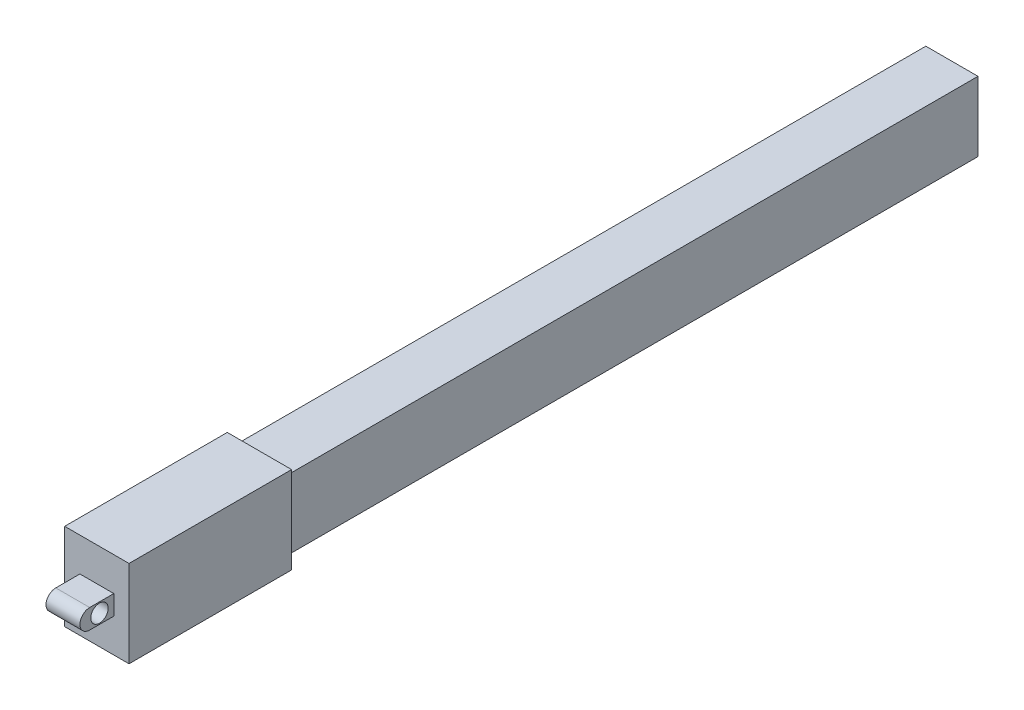
ISO-10303-21;
HEADER;
FILE_DESCRIPTION(('STEP AP214'),'2;1');
FILE_NAME('part.step','',(''),(''),'','','');
FILE_SCHEMA(('AUTOMOTIVE_DESIGN { 1 0 10303 214 1 1 1 1 }'));
ENDSEC;
DATA;
#1=APPLICATION_CONTEXT('core data for automotive mechanical design processes');
#2=APPLICATION_PROTOCOL_DEFINITION('international standard','automotive_design',2000,#1);
#3=PRODUCT_CONTEXT('',#1,'mechanical');
#4=PRODUCT('Part','Part','',(#3));
#5=PRODUCT_RELATED_PRODUCT_CATEGORY('part','',(#4));
#6=PRODUCT_DEFINITION_FORMATION('','',#4);
#7=PRODUCT_DEFINITION_CONTEXT('part definition',#1,'design');
#8=PRODUCT_DEFINITION('design','',#6,#7);
#9=PRODUCT_DEFINITION_SHAPE('','',#8);
#10=(LENGTH_UNIT() NAMED_UNIT(*) SI_UNIT(.MILLI.,.METRE.));
#11=(NAMED_UNIT(*) PLANE_ANGLE_UNIT() SI_UNIT($,.RADIAN.));
#12=(NAMED_UNIT(*) SI_UNIT($,.STERADIAN.) SOLID_ANGLE_UNIT());
#13=UNCERTAINTY_MEASURE_WITH_UNIT(LENGTH_MEASURE(1.E-05),#10,'distance_accuracy_value','');
#14=(GEOMETRIC_REPRESENTATION_CONTEXT(3) GLOBAL_UNCERTAINTY_ASSIGNED_CONTEXT((#13)) GLOBAL_UNIT_ASSIGNED_CONTEXT((#10,
#11,#12)) REPRESENTATION_CONTEXT('',''));
#15=CARTESIAN_POINT('',(0.,0.,0.));
#16=DIRECTION('',(0.,0.,1.));
#17=DIRECTION('',(1.,0.,0.));
#18=AXIS2_PLACEMENT_3D('',#15,#16,#17);
#19=CARTESIAN_POINT('',(3.9,-2.25,204.5));
#20=DIRECTION('',(-1.,0.,0.));
#21=DIRECTION('',(0.,0.,1.));
#22=AXIS2_PLACEMENT_3D('',#19,#20,#21);
#23=PLANE('',#22);
#24=CARTESIAN_POINT('',(3.9,0.,200.));
#25=DIRECTION('',(-1.,0.,0.));
#26=DIRECTION('',(0.,0.,1.));
#27=AXIS2_PLACEMENT_3D('',#24,#25,#26);
#28=CIRCLE('',#27,2.);
#29=CARTESIAN_POINT('',(3.9,0.,202.));
#30=VERTEX_POINT('',#29);
#31=EDGE_CURVE('E219',#30,#30,#28,.T.);
#32=ORIENTED_EDGE('',*,*,#31,.T.);
#33=EDGE_LOOP('',(#32));
#34=FACE_BOUND('',#33,.T.);
#35=DIRECTION('',(0.,0.,-1.));
#36=VECTOR('',#35,1.);
#37=CARTESIAN_POINT('',(3.9,2.25,204.5));
#38=LINE('',#37,#36);
#39=CARTESIAN_POINT('',(3.9,2.25,202.25));
#40=VERTEX_POINT('',#39);
#41=CARTESIAN_POINT('',(3.9,2.25,196.7));
#42=VERTEX_POINT('',#41);
#43=EDGE_CURVE('E238',#40,#42,#38,.T.);
#44=ORIENTED_EDGE('',*,*,#43,.F.);
#45=CARTESIAN_POINT('',(3.9,0.,202.25));
#46=DIRECTION('',(-1.,0.,0.));
#47=DIRECTION('',(0.,0.,1.));
#48=AXIS2_PLACEMENT_3D('',#45,#46,#47);
#49=CIRCLE('',#48,2.25);
#50=CARTESIAN_POINT('',(3.9,-2.25,202.25));
#51=VERTEX_POINT('',#50);
#52=EDGE_CURVE('E213',#51,#40,#49,.T.);
#53=ORIENTED_EDGE('',*,*,#52,.F.);
#54=DIRECTION('',(0.,0.,-1.));
#55=VECTOR('',#54,1.);
#56=CARTESIAN_POINT('',(3.9,-2.25,204.5));
#57=LINE('',#56,#55);
#58=CARTESIAN_POINT('',(3.9,-2.25,196.7));
#59=VERTEX_POINT('',#58);
#60=EDGE_CURVE('E79',#51,#59,#57,.T.);
#61=ORIENTED_EDGE('',*,*,#60,.T.);
#62=DIRECTION('',(0.,1.,0.));
#63=VECTOR('',#62,1.);
#64=CARTESIAN_POINT('',(3.9,-2.25,196.7));
#65=LINE('',#64,#63);
#66=EDGE_CURVE('E222',#59,#42,#65,.T.);
#67=ORIENTED_EDGE('',*,*,#66,.T.);
#68=EDGE_LOOP('',(#44,#53,#61,#67));
#69=FACE_BOUND('',#68,.T.);
#70=ADVANCED_FACE('F56',(#34,#69),#23,.F.);
#71=CARTESIAN_POINT('',(-3.9,-2.25,204.5));
#72=DIRECTION('',(1.,0.,0.));
#73=DIRECTION('',(0.,0.,-1.));
#74=AXIS2_PLACEMENT_3D('',#71,#72,#73);
#75=PLANE('',#74);
#76=CARTESIAN_POINT('',(-3.9,0.,200.));
#77=DIRECTION('',(-1.,0.,0.));
#78=DIRECTION('',(0.,0.,1.));
#79=AXIS2_PLACEMENT_3D('',#76,#77,#78);
#80=CIRCLE('',#79,2.);
#81=CARTESIAN_POINT('',(-3.9,0.,202.));
#82=VERTEX_POINT('',#81);
#83=EDGE_CURVE('E210',#82,#82,#80,.T.);
#84=ORIENTED_EDGE('',*,*,#83,.F.);
#85=EDGE_LOOP('',(#84));
#86=FACE_BOUND('',#85,.T.);
#87=CARTESIAN_POINT('',(-3.9,0.,202.25));
#88=DIRECTION('',(-1.,0.,0.));
#89=DIRECTION('',(0.,0.,1.));
#90=AXIS2_PLACEMENT_3D('',#87,#88,#89);
#91=CIRCLE('',#90,2.25);
#92=CARTESIAN_POINT('',(-3.9,-2.25,202.25));
#93=VERTEX_POINT('',#92);
#94=CARTESIAN_POINT('',(-3.9,2.25,202.25));
#95=VERTEX_POINT('',#94);
#96=EDGE_CURVE('E206',#93,#95,#91,.T.);
#97=ORIENTED_EDGE('',*,*,#96,.T.);
#98=DIRECTION('',(0.,0.,-1.));
#99=VECTOR('',#98,1.);
#100=CARTESIAN_POINT('',(-3.9,2.25,204.5));
#101=LINE('',#100,#99);
#102=CARTESIAN_POINT('',(-3.9,2.25,196.7));
#103=VERTEX_POINT('',#102);
#104=EDGE_CURVE('E236',#95,#103,#101,.T.);
#105=ORIENTED_EDGE('',*,*,#104,.T.);
#106=DIRECTION('',(0.,-1.,0.));
#107=VECTOR('',#106,1.);
#108=CARTESIAN_POINT('',(-3.9,-2.25,196.7));
#109=LINE('',#108,#107);
#110=CARTESIAN_POINT('',(-3.9,-2.25,196.7));
#111=VERTEX_POINT('',#110);
#112=EDGE_CURVE('E227',#103,#111,#109,.T.);
#113=ORIENTED_EDGE('',*,*,#112,.T.);
#114=DIRECTION('',(0.,0.,-1.));
#115=VECTOR('',#114,1.);
#116=CARTESIAN_POINT('',(-3.9,-2.25,204.5));
#117=LINE('',#116,#115);
#118=EDGE_CURVE('E234',#93,#111,#117,.T.);
#119=ORIENTED_EDGE('',*,*,#118,.F.);
#120=EDGE_LOOP('',(#97,#105,#113,#119));
#121=FACE_BOUND('',#120,.T.);
#122=ADVANCED_FACE('F353',(#86,#121),#75,.F.);
#123=CARTESIAN_POINT('',(-3.9,2.25,204.5));
#124=DIRECTION('',(0.,-1.,0.));
#125=DIRECTION('',(0.,0.,-1.));
#126=AXIS2_PLACEMENT_3D('',#123,#124,#125);
#127=PLANE('',#126);
#128=DIRECTION('',(-1.,0.,0.));
#129=VECTOR('',#128,1.);
#130=CARTESIAN_POINT('',(7.4,2.25,202.25));
#131=LINE('',#130,#129);
#132=EDGE_CURVE('E12',#40,#95,#131,.T.);
#133=ORIENTED_EDGE('',*,*,#132,.F.);
#134=ORIENTED_EDGE('',*,*,#43,.T.);
#135=DIRECTION('',(-1.,0.,0.));
#136=VECTOR('',#135,1.);
#137=CARTESIAN_POINT('',(-3.9,2.25,196.7));
#138=LINE('',#137,#136);
#139=EDGE_CURVE('E224',#42,#103,#138,.T.);
#140=ORIENTED_EDGE('',*,*,#139,.T.);
#141=ORIENTED_EDGE('',*,*,#104,.F.);
#142=EDGE_LOOP('',(#133,#134,#140,#141));
#143=FACE_BOUND('',#142,.T.);
#144=ADVANCED_FACE('F344',(#143),#127,.F.);
#145=CARTESIAN_POINT('',(0.,0.,196.7));
#146=DIRECTION('',(0.,0.,-1.));
#147=DIRECTION('',(-1.,0.,0.));
#148=AXIS2_PLACEMENT_3D('',#145,#146,#147);
#149=PLANE('',#148);
#150=DIRECTION('',(0.,1.,0.));
#151=VECTOR('',#150,1.);
#152=CARTESIAN_POINT('',(7.4,-10.,196.7));
#153=LINE('',#152,#151);
#154=CARTESIAN_POINT('',(7.4,-10.,196.7));
#155=VERTEX_POINT('',#154);
#156=CARTESIAN_POINT('',(7.4,10.,196.7));
#157=VERTEX_POINT('',#156);
#158=EDGE_CURVE('E241',#155,#157,#153,.T.);
#159=ORIENTED_EDGE('',*,*,#158,.T.);
#160=DIRECTION('',(-1.,0.,0.));
#161=VECTOR('',#160,1.);
#162=CARTESIAN_POINT('',(-7.4,10.,196.7));
#163=LINE('',#162,#161);
#164=CARTESIAN_POINT('',(-7.4,10.,196.7));
#165=VERTEX_POINT('',#164);
#166=EDGE_CURVE('E244',#157,#165,#163,.T.);
#167=ORIENTED_EDGE('',*,*,#166,.T.);
#168=DIRECTION('',(0.,-1.,0.));
#169=VECTOR('',#168,1.);
#170=CARTESIAN_POINT('',(-7.4,-10.,196.7));
#171=LINE('',#170,#169);
#172=CARTESIAN_POINT('',(-7.4,-10.,196.7));
#173=VERTEX_POINT('',#172);
#174=EDGE_CURVE('E247',#165,#173,#171,.T.);
#175=ORIENTED_EDGE('',*,*,#174,.T.);
#176=DIRECTION('',(1.,0.,0.));
#177=VECTOR('',#176,1.);
#178=CARTESIAN_POINT('',(-7.4,-10.,196.7));
#179=LINE('',#178,#177);
#180=EDGE_CURVE('E249',#173,#155,#179,.T.);
#181=ORIENTED_EDGE('',*,*,#180,.T.);
#182=EDGE_LOOP('',(#159,#167,#175,#181));
#183=FACE_BOUND('',#182,.T.);
#184=ORIENTED_EDGE('',*,*,#66,.F.);
#185=DIRECTION('',(1.,0.,0.));
#186=VECTOR('',#185,1.);
#187=CARTESIAN_POINT('',(-3.9,-2.25,196.7));
#188=LINE('',#187,#186);
#189=EDGE_CURVE('E230',#111,#59,#188,.T.);
#190=ORIENTED_EDGE('',*,*,#189,.F.);
#191=ORIENTED_EDGE('',*,*,#112,.F.);
#192=ORIENTED_EDGE('',*,*,#139,.F.);
#193=EDGE_LOOP('',(#184,#190,#191,#192));
#194=FACE_BOUND('',#193,.T.);
#195=ADVANCED_FACE('F341',(#183,#194),#149,.F.);
#196=CARTESIAN_POINT('',(6.,-8.,159.3));
#197=DIRECTION('',(-1.,0.,0.));
#198=DIRECTION('',(0.,0.,1.));
#199=AXIS2_PLACEMENT_3D('',#196,#197,#198);
#200=PLANE('',#199);
#201=DIRECTION('',(0.,1.,0.));
#202=VECTOR('',#201,1.);
#203=CARTESIAN_POINT('',(6.,-8.,0.));
#204=LINE('',#203,#202);
#205=CARTESIAN_POINT('',(6.,-8.,0.));
#206=VERTEX_POINT('',#205);
#207=CARTESIAN_POINT('',(6.,8.,0.));
#208=VERTEX_POINT('',#207);
#209=EDGE_CURVE('E270',#206,#208,#204,.T.);
#210=ORIENTED_EDGE('',*,*,#209,.T.);
#211=DIRECTION('',(0.,0.,-1.));
#212=VECTOR('',#211,1.);
#213=CARTESIAN_POINT('',(6.,8.,159.3));
#214=LINE('',#213,#212);
#215=CARTESIAN_POINT('',(6.,8.,159.3));
#216=VERTEX_POINT('',#215);
#217=EDGE_CURVE('E64',#216,#208,#214,.T.);
#218=ORIENTED_EDGE('',*,*,#217,.F.);
#219=DIRECTION('',(0.,1.,0.));
#220=VECTOR('',#219,1.);
#221=CARTESIAN_POINT('',(6.,-8.,159.3));
#222=LINE('',#221,#220);
#223=CARTESIAN_POINT('',(6.,-8.,159.3));
#224=VERTEX_POINT('',#223);
#225=EDGE_CURVE('E271',#224,#216,#222,.T.);
#226=ORIENTED_EDGE('',*,*,#225,.F.);
#227=DIRECTION('',(0.,0.,-1.));
#228=VECTOR('',#227,1.);
#229=CARTESIAN_POINT('',(6.,-8.,159.3));
#230=LINE('',#229,#228);
#231=EDGE_CURVE('E284',#224,#206,#230,.T.);
#232=ORIENTED_EDGE('',*,*,#231,.T.);
#233=EDGE_LOOP('',(#210,#218,#226,#232));
#234=FACE_BOUND('',#233,.T.);
#235=ADVANCED_FACE('F58',(#234),#200,.F.);
#236=CARTESIAN_POINT('',(-6.,8.,159.3));
#237=DIRECTION('',(0.,-1.,0.));
#238=DIRECTION('',(0.,0.,-1.));
#239=AXIS2_PLACEMENT_3D('',#236,#237,#238);
#240=PLANE('',#239);
#241=DIRECTION('',(-1.,0.,0.));
#242=VECTOR('',#241,1.);
#243=CARTESIAN_POINT('',(-6.,8.,0.));
#244=LINE('',#243,#242);
#245=CARTESIAN_POINT('',(-6.,8.,0.));
#246=VERTEX_POINT('',#245);
#247=EDGE_CURVE('E287',#208,#246,#244,.T.);
#248=ORIENTED_EDGE('',*,*,#247,.T.);
#249=DIRECTION('',(0.,0.,-1.));
#250=VECTOR('',#249,1.);
#251=CARTESIAN_POINT('',(-6.,8.,159.3));
#252=LINE('',#251,#250);
#253=CARTESIAN_POINT('',(-6.,8.,159.3));
#254=VERTEX_POINT('',#253);
#255=EDGE_CURVE('E297',#254,#246,#252,.T.);
#256=ORIENTED_EDGE('',*,*,#255,.F.);
#257=DIRECTION('',(-1.,0.,0.));
#258=VECTOR('',#257,1.);
#259=CARTESIAN_POINT('',(-6.,8.,159.3));
#260=LINE('',#259,#258);
#261=EDGE_CURVE('E274',#216,#254,#260,.T.);
#262=ORIENTED_EDGE('',*,*,#261,.F.);
#263=ORIENTED_EDGE('',*,*,#217,.T.);
#264=EDGE_LOOP('',(#248,#256,#262,#263));
#265=FACE_BOUND('',#264,.T.);
#266=ADVANCED_FACE('F302',(#265),#240,.F.);
#267=CARTESIAN_POINT('',(-6.,-8.,159.3));
#268=DIRECTION('',(1.,0.,0.));
#269=DIRECTION('',(0.,0.,-1.));
#270=AXIS2_PLACEMENT_3D('',#267,#268,#269);
#271=PLANE('',#270);
#272=DIRECTION('',(0.,-1.,0.));
#273=VECTOR('',#272,1.);
#274=CARTESIAN_POINT('',(-6.,-8.,0.));
#275=LINE('',#274,#273);
#276=CARTESIAN_POINT('',(-6.,-8.,0.));
#277=VERTEX_POINT('',#276);
#278=EDGE_CURVE('E289',#246,#277,#275,.T.);
#279=ORIENTED_EDGE('',*,*,#278,.T.);
#280=DIRECTION('',(0.,0.,-1.));
#281=VECTOR('',#280,1.);
#282=CARTESIAN_POINT('',(-6.,-8.,159.3));
#283=LINE('',#282,#281);
#284=CARTESIAN_POINT('',(-6.,-8.,159.3));
#285=VERTEX_POINT('',#284);
#286=EDGE_CURVE('E294',#285,#277,#283,.T.);
#287=ORIENTED_EDGE('',*,*,#286,.F.);
#288=DIRECTION('',(0.,-1.,0.));
#289=VECTOR('',#288,1.);
#290=CARTESIAN_POINT('',(-6.,-8.,159.3));
#291=LINE('',#290,#289);
#292=EDGE_CURVE('E278',#254,#285,#291,.T.);
#293=ORIENTED_EDGE('',*,*,#292,.F.);
#294=ORIENTED_EDGE('',*,*,#255,.T.);
#295=EDGE_LOOP('',(#279,#287,#293,#294));
#296=FACE_BOUND('',#295,.T.);
#297=ADVANCED_FACE('F311',(#296),#271,.F.);
#298=CARTESIAN_POINT('',(-6.,-8.,159.3));
#299=DIRECTION('',(0.,1.,0.));
#300=DIRECTION('',(0.,0.,1.));
#301=AXIS2_PLACEMENT_3D('',#298,#299,#300);
#302=PLANE('',#301);
#303=DIRECTION('',(1.,0.,0.));
#304=VECTOR('',#303,1.);
#305=CARTESIAN_POINT('',(-6.,-8.,0.));
#306=LINE('',#305,#304);
#307=EDGE_CURVE('E275',#277,#206,#306,.T.);
#308=ORIENTED_EDGE('',*,*,#307,.T.);
#309=ORIENTED_EDGE('',*,*,#231,.F.);
#310=DIRECTION('',(1.,0.,0.));
#311=VECTOR('',#310,1.);
#312=CARTESIAN_POINT('',(-6.,-8.,159.3));
#313=LINE('',#312,#311);
#314=EDGE_CURVE('E281',#285,#224,#313,.T.);
#315=ORIENTED_EDGE('',*,*,#314,.F.);
#316=ORIENTED_EDGE('',*,*,#286,.T.);
#317=EDGE_LOOP('',(#308,#309,#315,#316));
#318=FACE_BOUND('',#317,.T.);
#319=ADVANCED_FACE('F315',(#318),#302,.F.);
#320=CARTESIAN_POINT('',(0.,0.,0.));
#321=DIRECTION('',(0.,0.,-1.));
#322=DIRECTION('',(-1.,0.,0.));
#323=AXIS2_PLACEMENT_3D('',#320,#321,#322);
#324=PLANE('',#323);
#325=DIRECTION('',(0.,1.,0.));
#326=VECTOR('',#325,1.);
#327=CARTESIAN_POINT('',(-3.05,-4.5,0.));
#328=LINE('',#327,#326);
#329=CARTESIAN_POINT('',(-3.05,-4.5,0.));
#330=VERTEX_POINT('',#329);
#331=CARTESIAN_POINT('',(-3.05,4.5,0.));
#332=VERTEX_POINT('',#331);
#333=EDGE_CURVE('E71',#330,#332,#328,.T.);
#334=ORIENTED_EDGE('',*,*,#333,.F.);
#335=DIRECTION('',(-1.,0.,0.));
#336=VECTOR('',#335,1.);
#337=CARTESIAN_POINT('',(3.05,-4.5,0.));
#338=LINE('',#337,#336);
#339=CARTESIAN_POINT('',(3.05,-4.5,0.));
#340=VERTEX_POINT('',#339);
#341=EDGE_CURVE('E191',#340,#330,#338,.T.);
#342=ORIENTED_EDGE('',*,*,#341,.F.);
#343=DIRECTION('',(0.,-1.,0.));
#344=VECTOR('',#343,1.);
#345=CARTESIAN_POINT('',(3.05,-4.5,0.));
#346=LINE('',#345,#344);
#347=CARTESIAN_POINT('',(3.05,4.5,0.));
#348=VERTEX_POINT('',#347);
#349=EDGE_CURVE('E194',#348,#340,#346,.T.);
#350=ORIENTED_EDGE('',*,*,#349,.F.);
#351=DIRECTION('',(1.,0.,0.));
#352=VECTOR('',#351,1.);
#353=CARTESIAN_POINT('',(3.05,4.5,0.));
#354=LINE('',#353,#352);
#355=EDGE_CURVE('E200',#332,#348,#354,.T.);
#356=ORIENTED_EDGE('',*,*,#355,.F.);
#357=EDGE_LOOP('',(#334,#342,#350,#356));
#358=FACE_BOUND('',#357,.T.);
#359=ORIENTED_EDGE('',*,*,#209,.F.);
#360=ORIENTED_EDGE('',*,*,#307,.F.);
#361=ORIENTED_EDGE('',*,*,#278,.F.);
#362=ORIENTED_EDGE('',*,*,#247,.F.);
#363=EDGE_LOOP('',(#359,#360,#361,#362));
#364=FACE_BOUND('',#363,.T.);
#365=ADVANCED_FACE('F308',(#358,#364),#324,.T.);
#366=CARTESIAN_POINT('',(7.4,-10.,196.7));
#367=DIRECTION('',(-1.,0.,0.));
#368=DIRECTION('',(0.,0.,1.));
#369=AXIS2_PLACEMENT_3D('',#366,#367,#368);
#370=PLANE('',#369);
#371=DIRECTION('',(0.,1.,0.));
#372=VECTOR('',#371,1.);
#373=CARTESIAN_POINT('',(7.4,-10.,159.3));
#374=LINE('',#373,#372);
#375=CARTESIAN_POINT('',(7.4,-10.,159.3));
#376=VERTEX_POINT('',#375);
#377=CARTESIAN_POINT('',(7.4,10.,159.3));
#378=VERTEX_POINT('',#377);
#379=EDGE_CURVE('E240',#376,#378,#374,.T.);
#380=ORIENTED_EDGE('',*,*,#379,.T.);
#381=DIRECTION('',(0.,0.,-1.));
#382=VECTOR('',#381,1.);
#383=CARTESIAN_POINT('',(7.4,10.,196.7));
#384=LINE('',#383,#382);
#385=EDGE_CURVE('E267',#157,#378,#384,.T.);
#386=ORIENTED_EDGE('',*,*,#385,.F.);
#387=ORIENTED_EDGE('',*,*,#158,.F.);
#388=DIRECTION('',(0.,0.,-1.));
#389=VECTOR('',#388,1.);
#390=CARTESIAN_POINT('',(7.4,-10.,196.7));
#391=LINE('',#390,#389);
#392=EDGE_CURVE('E251',#155,#376,#391,.T.);
#393=ORIENTED_EDGE('',*,*,#392,.T.);
#394=EDGE_LOOP('',(#380,#386,#387,#393));
#395=FACE_BOUND('',#394,.T.);
#396=ADVANCED_FACE('F328',(#395),#370,.F.);
#397=CARTESIAN_POINT('',(-7.4,10.,196.7));
#398=DIRECTION('',(0.,-1.,0.));
#399=DIRECTION('',(0.,0.,-1.));
#400=AXIS2_PLACEMENT_3D('',#397,#398,#399);
#401=PLANE('',#400);
#402=DIRECTION('',(-1.,0.,0.));
#403=VECTOR('',#402,1.);
#404=CARTESIAN_POINT('',(-7.4,10.,159.3));
#405=LINE('',#404,#403);
#406=CARTESIAN_POINT('',(-7.4,10.,159.3));
#407=VERTEX_POINT('',#406);
#408=EDGE_CURVE('E254',#378,#407,#405,.T.);
#409=ORIENTED_EDGE('',*,*,#408,.T.);
#410=DIRECTION('',(0.,0.,-1.));
#411=VECTOR('',#410,1.);
#412=CARTESIAN_POINT('',(-7.4,10.,196.7));
#413=LINE('',#412,#411);
#414=EDGE_CURVE('E264',#165,#407,#413,.T.);
#415=ORIENTED_EDGE('',*,*,#414,.F.);
#416=ORIENTED_EDGE('',*,*,#166,.F.);
#417=ORIENTED_EDGE('',*,*,#385,.T.);
#418=EDGE_LOOP('',(#409,#415,#416,#417));
#419=FACE_BOUND('',#418,.T.);
#420=ADVANCED_FACE('F339',(#419),#401,.F.);
#421=CARTESIAN_POINT('',(-7.4,-10.,196.7));
#422=DIRECTION('',(1.,0.,0.));
#423=DIRECTION('',(0.,0.,-1.));
#424=AXIS2_PLACEMENT_3D('',#421,#422,#423);
#425=PLANE('',#424);
#426=DIRECTION('',(0.,-1.,0.));
#427=VECTOR('',#426,1.);
#428=CARTESIAN_POINT('',(-7.4,-10.,159.3));
#429=LINE('',#428,#427);
#430=CARTESIAN_POINT('',(-7.4,-10.,159.3));
#431=VERTEX_POINT('',#430);
#432=EDGE_CURVE('E256',#407,#431,#429,.T.);
#433=ORIENTED_EDGE('',*,*,#432,.T.);
#434=DIRECTION('',(0.,0.,-1.));
#435=VECTOR('',#434,1.);
#436=CARTESIAN_POINT('',(-7.4,-10.,196.7));
#437=LINE('',#436,#435);
#438=EDGE_CURVE('E261',#173,#431,#437,.T.);
#439=ORIENTED_EDGE('',*,*,#438,.F.);
#440=ORIENTED_EDGE('',*,*,#174,.F.);
#441=ORIENTED_EDGE('',*,*,#414,.T.);
#442=EDGE_LOOP('',(#433,#439,#440,#441));
#443=FACE_BOUND('',#442,.T.);
#444=ADVANCED_FACE('F336',(#443),#425,.F.);
#445=CARTESIAN_POINT('',(-7.4,-10.,196.7));
#446=DIRECTION('',(0.,1.,0.));
#447=DIRECTION('',(0.,0.,1.));
#448=AXIS2_PLACEMENT_3D('',#445,#446,#447);
#449=PLANE('',#448);
#450=DIRECTION('',(1.,0.,0.));
#451=VECTOR('',#450,1.);
#452=CARTESIAN_POINT('',(-7.4,-10.,159.3));
#453=LINE('',#452,#451);
#454=EDGE_CURVE('E245',#431,#376,#453,.T.);
#455=ORIENTED_EDGE('',*,*,#454,.T.);
#456=ORIENTED_EDGE('',*,*,#392,.F.);
#457=ORIENTED_EDGE('',*,*,#180,.F.);
#458=ORIENTED_EDGE('',*,*,#438,.T.);
#459=EDGE_LOOP('',(#455,#456,#457,#458));
#460=FACE_BOUND('',#459,.T.);
#461=ADVANCED_FACE('F321',(#460),#449,.F.);
#462=CARTESIAN_POINT('',(0.,0.,159.3));
#463=DIRECTION('',(0.,0.,-1.));
#464=DIRECTION('',(-1.,0.,0.));
#465=AXIS2_PLACEMENT_3D('',#462,#463,#464);
#466=PLANE('',#465);
#467=ORIENTED_EDGE('',*,*,#314,.T.);
#468=ORIENTED_EDGE('',*,*,#225,.T.);
#469=ORIENTED_EDGE('',*,*,#261,.T.);
#470=ORIENTED_EDGE('',*,*,#292,.T.);
#471=EDGE_LOOP('',(#467,#468,#469,#470));
#472=FACE_BOUND('',#471,.T.);
#473=ORIENTED_EDGE('',*,*,#379,.F.);
#474=ORIENTED_EDGE('',*,*,#454,.F.);
#475=ORIENTED_EDGE('',*,*,#432,.F.);
#476=ORIENTED_EDGE('',*,*,#408,.F.);
#477=EDGE_LOOP('',(#473,#474,#475,#476));
#478=FACE_BOUND('',#477,.T.);
#479=ADVANCED_FACE('F317',(#472,#478),#466,.T.);
#480=CARTESIAN_POINT('',(-3.9,-2.25,204.5));
#481=DIRECTION('',(0.,1.,0.));
#482=DIRECTION('',(0.,0.,1.));
#483=AXIS2_PLACEMENT_3D('',#480,#481,#482);
#484=PLANE('',#483);
#485=ORIENTED_EDGE('',*,*,#60,.F.);
#486=DIRECTION('',(-1.,0.,0.));
#487=VECTOR('',#486,1.);
#488=CARTESIAN_POINT('',(7.4,-2.25,202.25));
#489=LINE('',#488,#487);
#490=EDGE_CURVE('E214',#51,#93,#489,.T.);
#491=ORIENTED_EDGE('',*,*,#490,.T.);
#492=ORIENTED_EDGE('',*,*,#118,.T.);
#493=ORIENTED_EDGE('',*,*,#189,.T.);
#494=EDGE_LOOP('',(#485,#491,#492,#493));
#495=FACE_BOUND('',#494,.T.);
#496=ADVANCED_FACE('F320',(#495),#484,.F.);
#497=CARTESIAN_POINT('',(7.4,0.,202.25));
#498=DIRECTION('',(-1.,0.,0.));
#499=DIRECTION('',(0.,0.,1.));
#500=AXIS2_PLACEMENT_3D('',#497,#498,#499);
#501=CYLINDRICAL_SURFACE('',#500,2.25);
#502=ORIENTED_EDGE('',*,*,#52,.T.);
#503=ORIENTED_EDGE('',*,*,#132,.T.);
#504=ORIENTED_EDGE('',*,*,#96,.F.);
#505=ORIENTED_EDGE('',*,*,#490,.F.);
#506=EDGE_LOOP('',(#502,#503,#504,#505));
#507=FACE_BOUND('',#506,.T.);
#508=ADVANCED_FACE('F358',(#507),#501,.T.);
#509=CARTESIAN_POINT('',(7.4,0.,200.));
#510=DIRECTION('',(-1.,0.,0.));
#511=DIRECTION('',(0.,0.,1.));
#512=AXIS2_PLACEMENT_3D('',#509,#510,#511);
#513=CYLINDRICAL_SURFACE('',#512,2.);
#514=CARTESIAN_POINT('',(-3.9,0.,202.));
#515=CARTESIAN_POINT('',(-3.81875,0.,202.));
#516=CARTESIAN_POINT('',(-3.7375,0.,202.));
#517=CARTESIAN_POINT('',(-3.575,0.,202.));
#518=CARTESIAN_POINT('',(-3.49375,0.,202.));
#519=CARTESIAN_POINT('',(-3.33125,0.,202.));
#520=CARTESIAN_POINT('',(-3.25,0.,202.));
#521=CARTESIAN_POINT('',(-3.0875,0.,202.));
#522=CARTESIAN_POINT('',(-3.00625,0.,202.));
#523=CARTESIAN_POINT('',(-2.84375,0.,202.));
#524=CARTESIAN_POINT('',(-2.7625,0.,202.));
#525=CARTESIAN_POINT('',(-2.6,0.,202.));
#526=CARTESIAN_POINT('',(-2.51875,0.,202.));
#527=CARTESIAN_POINT('',(-2.35625,0.,202.));
#528=CARTESIAN_POINT('',(-2.275,0.,202.));
#529=CARTESIAN_POINT('',(-2.1125,0.,202.));
#530=CARTESIAN_POINT('',(-2.03125,0.,202.));
#531=CARTESIAN_POINT('',(-1.86875,0.,202.));
#532=CARTESIAN_POINT('',(-1.7875,0.,202.));
#533=CARTESIAN_POINT('',(-1.625,0.,202.));
#534=CARTESIAN_POINT('',(-1.54375,0.,202.));
#535=CARTESIAN_POINT('',(-1.38125,0.,202.));
#536=CARTESIAN_POINT('',(-1.3,0.,202.));
#537=CARTESIAN_POINT('',(-1.1375,0.,202.));
#538=CARTESIAN_POINT('',(-1.05625,0.,202.));
#539=CARTESIAN_POINT('',(-0.893749999999998,0.,202.));
#540=CARTESIAN_POINT('',(-0.812499999999998,0.,202.));
#541=CARTESIAN_POINT('',(-0.649999999999998,0.,202.));
#542=CARTESIAN_POINT('',(-0.568749999999998,0.,202.));
#543=CARTESIAN_POINT('',(-0.406249999999999,0.,202.));
#544=CARTESIAN_POINT('',(-0.324999999999999,0.,202.));
#545=CARTESIAN_POINT('',(-0.162499999999999,0.,202.));
#546=CARTESIAN_POINT('',(-0.0812499999999992,0.,202.));
#547=CARTESIAN_POINT('',(0.0812500000000009,0.,202.));
#548=CARTESIAN_POINT('',(0.162500000000001,0.,202.));
#549=CARTESIAN_POINT('',(0.325000000000001,0.,202.));
#550=CARTESIAN_POINT('',(0.406250000000001,0.,202.));
#551=CARTESIAN_POINT('',(0.568750000000001,0.,202.));
#552=CARTESIAN_POINT('',(0.650000000000001,0.,202.));
#553=CARTESIAN_POINT('',(0.812500000000001,0.,202.));
#554=CARTESIAN_POINT('',(0.893750000000001,0.,202.));
#555=CARTESIAN_POINT('',(1.05625,0.,202.));
#556=CARTESIAN_POINT('',(1.1375,0.,202.));
#557=CARTESIAN_POINT('',(1.3,0.,202.));
#558=CARTESIAN_POINT('',(1.38125,0.,202.));
#559=CARTESIAN_POINT('',(1.54375,0.,202.));
#560=CARTESIAN_POINT('',(1.625,0.,202.));
#561=CARTESIAN_POINT('',(1.7875,0.,202.));
#562=CARTESIAN_POINT('',(1.86875,0.,202.));
#563=CARTESIAN_POINT('',(2.03125,0.,202.));
#564=CARTESIAN_POINT('',(2.1125,0.,202.));
#565=CARTESIAN_POINT('',(2.275,0.,202.));
#566=CARTESIAN_POINT('',(2.35625,0.,202.));
#567=CARTESIAN_POINT('',(2.51875,0.,202.));
#568=CARTESIAN_POINT('',(2.6,0.,202.));
#569=CARTESIAN_POINT('',(2.7625,0.,202.));
#570=CARTESIAN_POINT('',(2.84375,0.,202.));
#571=CARTESIAN_POINT('',(3.00625,0.,202.));
#572=CARTESIAN_POINT('',(3.0875,0.,202.));
#573=CARTESIAN_POINT('',(3.25,0.,202.));
#574=CARTESIAN_POINT('',(3.33125,0.,202.));
#575=CARTESIAN_POINT('',(3.49375,0.,202.));
#576=CARTESIAN_POINT('',(3.575,0.,202.));
#577=CARTESIAN_POINT('',(3.7375,0.,202.));
#578=CARTESIAN_POINT('',(3.81875,0.,202.));
#579=CARTESIAN_POINT('',(3.9,0.,202.));
#580=B_SPLINE_CURVE_WITH_KNOTS('',3,(#514,#515,#516,#517,#518,#519,#520,#521,#522,#523,#524,
#525,#526,#527,#528,#529,#530,#531,#532,#533,#534,#535,#536,#537,#538,#539,#540,#541,#542,#543,
#544,#545,#546,#547,#548,#549,#550,#551,#552,#553,#554,#555,#556,#557,#558,#559,#560,#561,#562,
#563,#564,#565,#566,#567,#568,#569,#570,#571,#572,#573,#574,#575,#576,#577,#578,#579),
.UNSPECIFIED.,.F.,.F.,(4,2,2,2,2,2,2,2,2,2,2,2,2,2,2,2,2,2,2,2,2,2,2,2,2,2,2,2,2,2,2,2,4),(0.,
0.243750000000001,0.4875,0.731249999999999,0.975,1.21875,1.4625,1.70625,1.95,2.19375,2.4375,
2.68125,2.925,3.16875,3.4125,3.65625,3.9,4.14375,4.3875,4.63125,4.875,5.11875,5.3625,5.60625,
5.85,6.09375,6.3375,6.58125,6.825,7.06875,7.3125,7.55625,7.8),.UNSPECIFIED.);
#581=EDGE_CURVE('BSEAM360',#82,#30,#580,.T.);
#582=ORIENTED_EDGE('',*,*,#83,.T.);
#583=ORIENTED_EDGE('',*,*,#31,.F.);
#584=ORIENTED_EDGE('',*,*,#581,.T.);
#585=ORIENTED_EDGE('',*,*,#581,.F.);
#586=EDGE_LOOP('',(#582,#584,#583,#585));
#587=FACE_BOUND('',#586,.T.);
#588=ADVANCED_FACE('F360',(#587),#513,.F.);
#589=CARTESIAN_POINT('',(-3.05,-4.5,192.2));
#590=DIRECTION('',(-1.,0.,0.));
#591=DIRECTION('',(0.,0.,1.));
#592=AXIS2_PLACEMENT_3D('',#589,#590,#591);
#593=PLANE('',#592);
#594=ORIENTED_EDGE('',*,*,#333,.T.);
#595=DIRECTION('',(0.,0.,-1.));
#596=VECTOR('',#595,1.);
#597=CARTESIAN_POINT('',(-3.05,4.5,192.2));
#598=LINE('',#597,#596);
#599=CARTESIAN_POINT('',(-3.05,4.5,192.2));
#600=VERTEX_POINT('',#599);
#601=EDGE_CURVE('E169',#600,#332,#598,.T.);
#602=ORIENTED_EDGE('',*,*,#601,.F.);
#603=DIRECTION('',(0.,1.,0.));
#604=VECTOR('',#603,1.);
#605=CARTESIAN_POINT('',(-3.05,-4.5,192.2));
#606=LINE('',#605,#604);
#607=CARTESIAN_POINT('',(-3.05,-4.5,192.2));
#608=VERTEX_POINT('',#607);
#609=EDGE_CURVE('E173',#608,#600,#606,.T.);
#610=ORIENTED_EDGE('',*,*,#609,.F.);
#611=DIRECTION('',(0.,0.,-1.));
#612=VECTOR('',#611,1.);
#613=CARTESIAN_POINT('',(-3.05,-4.5,192.2));
#614=LINE('',#613,#612);
#615=EDGE_CURVE('E204',#608,#330,#614,.T.);
#616=ORIENTED_EDGE('',*,*,#615,.T.);
#617=EDGE_LOOP('',(#594,#602,#610,#616));
#618=FACE_BOUND('',#617,.T.);
#619=ADVANCED_FACE('F171',(#618),#593,.F.);
#620=CARTESIAN_POINT('',(3.05,-4.5,192.2));
#621=DIRECTION('',(0.,-1.,0.));
#622=DIRECTION('',(0.,0.,-1.));
#623=AXIS2_PLACEMENT_3D('',#620,#621,#622);
#624=PLANE('',#623);
#625=ORIENTED_EDGE('',*,*,#341,.T.);
#626=ORIENTED_EDGE('',*,*,#615,.F.);
#627=DIRECTION('',(-1.,0.,0.));
#628=VECTOR('',#627,1.);
#629=CARTESIAN_POINT('',(3.05,-4.5,192.2));
#630=LINE('',#629,#628);
#631=CARTESIAN_POINT('',(3.05,-4.5,192.2));
#632=VERTEX_POINT('',#631);
#633=EDGE_CURVE('E179',#632,#608,#630,.T.);
#634=ORIENTED_EDGE('',*,*,#633,.F.);
#635=DIRECTION('',(0.,0.,-1.));
#636=VECTOR('',#635,1.);
#637=CARTESIAN_POINT('',(3.05,-4.5,192.2));
#638=LINE('',#637,#636);
#639=EDGE_CURVE('E207',#632,#340,#638,.T.);
#640=ORIENTED_EDGE('',*,*,#639,.T.);
#641=EDGE_LOOP('',(#625,#626,#634,#640));
#642=FACE_BOUND('',#641,.T.);
#643=ADVANCED_FACE('F441',(#642),#624,.F.);
#644=CARTESIAN_POINT('',(3.05,-4.5,192.2));
#645=DIRECTION('',(1.,0.,0.));
#646=DIRECTION('',(0.,0.,-1.));
#647=AXIS2_PLACEMENT_3D('',#644,#645,#646);
#648=PLANE('',#647);
#649=ORIENTED_EDGE('',*,*,#349,.T.);
#650=ORIENTED_EDGE('',*,*,#639,.F.);
#651=DIRECTION('',(0.,-1.,0.));
#652=VECTOR('',#651,1.);
#653=CARTESIAN_POINT('',(3.05,-4.5,192.2));
#654=LINE('',#653,#652);
#655=CARTESIAN_POINT('',(3.05,4.5,192.2));
#656=VERTEX_POINT('',#655);
#657=EDGE_CURVE('E187',#656,#632,#654,.T.);
#658=ORIENTED_EDGE('',*,*,#657,.F.);
#659=DIRECTION('',(0.,0.,-1.));
#660=VECTOR('',#659,1.);
#661=CARTESIAN_POINT('',(3.05,4.5,192.2));
#662=LINE('',#661,#660);
#663=EDGE_CURVE('E178',#656,#348,#662,.T.);
#664=ORIENTED_EDGE('',*,*,#663,.T.);
#665=EDGE_LOOP('',(#649,#650,#658,#664));
#666=FACE_BOUND('',#665,.T.);
#667=ADVANCED_FACE('F449',(#666),#648,.F.);
#668=CARTESIAN_POINT('',(3.05,4.5,192.2));
#669=DIRECTION('',(0.,1.,0.));
#670=DIRECTION('',(0.,0.,1.));
#671=AXIS2_PLACEMENT_3D('',#668,#669,#670);
#672=PLANE('',#671);
#673=ORIENTED_EDGE('',*,*,#355,.T.);
#674=ORIENTED_EDGE('',*,*,#663,.F.);
#675=DIRECTION('',(1.,0.,0.));
#676=VECTOR('',#675,1.);
#677=CARTESIAN_POINT('',(3.05,4.5,192.2));
#678=LINE('',#677,#676);
#679=EDGE_CURVE('E182',#600,#656,#678,.T.);
#680=ORIENTED_EDGE('',*,*,#679,.F.);
#681=ORIENTED_EDGE('',*,*,#601,.T.);
#682=EDGE_LOOP('',(#673,#674,#680,#681));
#683=FACE_BOUND('',#682,.T.);
#684=ADVANCED_FACE('F183',(#683),#672,.F.);
#685=CARTESIAN_POINT('',(0.,0.,192.2));
#686=DIRECTION('',(0.,0.,1.));
#687=DIRECTION('',(1.,0.,0.));
#688=AXIS2_PLACEMENT_3D('',#685,#686,#687);
#689=PLANE('',#688);
#690=ORIENTED_EDGE('',*,*,#609,.T.);
#691=ORIENTED_EDGE('',*,*,#679,.T.);
#692=ORIENTED_EDGE('',*,*,#657,.T.);
#693=ORIENTED_EDGE('',*,*,#633,.T.);
#694=EDGE_LOOP('',(#690,#691,#692,#693));
#695=FACE_BOUND('',#694,.T.);
#696=ADVANCED_FACE('F189',(#695),#689,.F.);
#697=CLOSED_SHELL('',(#70,#122,#144,#195,#235,#266,#297,#319,#365,#396,#420,#444,#461,#479,#496,
#508,#588,#619,#643,#667,#684,#696));
#698=MANIFOLD_SOLID_BREP('B2',#697);
#699=ADVANCED_BREP_SHAPE_REPRESENTATION('',(#18,#698),#14);
#700=SHAPE_DEFINITION_REPRESENTATION(#9,#699);
ENDSEC;
END-ISO-10303-21;
